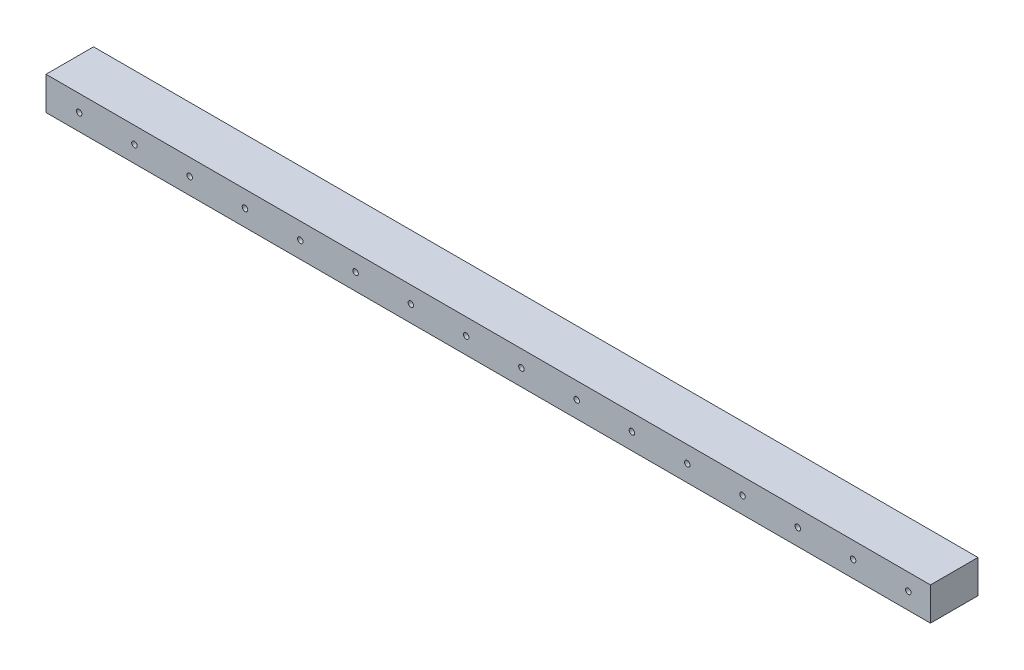
ISO-10303-21;
HEADER;
FILE_DESCRIPTION(('STEP AP214'),'2;1');
FILE_NAME('part.step','',(''),(''),'','','');
FILE_SCHEMA(('AUTOMOTIVE_DESIGN { 1 0 10303 214 1 1 1 1 }'));
ENDSEC;
DATA;
#1=APPLICATION_CONTEXT('core data for automotive mechanical design processes');
#2=APPLICATION_PROTOCOL_DEFINITION('international standard','automotive_design',2000,#1);
#3=PRODUCT_CONTEXT('',#1,'mechanical');
#4=PRODUCT('Part','Part','',(#3));
#5=PRODUCT_RELATED_PRODUCT_CATEGORY('part','',(#4));
#6=PRODUCT_DEFINITION_FORMATION('','',#4);
#7=PRODUCT_DEFINITION_CONTEXT('part definition',#1,'design');
#8=PRODUCT_DEFINITION('design','',#6,#7);
#9=PRODUCT_DEFINITION_SHAPE('','',#8);
#10=(LENGTH_UNIT() NAMED_UNIT(*) SI_UNIT(.MILLI.,.METRE.));
#11=(NAMED_UNIT(*) PLANE_ANGLE_UNIT() SI_UNIT($,.RADIAN.));
#12=(NAMED_UNIT(*) SI_UNIT($,.STERADIAN.) SOLID_ANGLE_UNIT());
#13=UNCERTAINTY_MEASURE_WITH_UNIT(LENGTH_MEASURE(1.E-05),#10,'distance_accuracy_value','');
#14=(GEOMETRIC_REPRESENTATION_CONTEXT(3) GLOBAL_UNCERTAINTY_ASSIGNED_CONTEXT((#13)) GLOBAL_UNIT_ASSIGNED_CONTEXT((#10,
#11,#12)) REPRESENTATION_CONTEXT('',''));
#15=CARTESIAN_POINT('',(0.,0.,0.));
#16=DIRECTION('',(0.,0.,1.));
#17=DIRECTION('',(1.,0.,0.));
#18=AXIS2_PLACEMENT_3D('',#15,#16,#17);
#19=CARTESIAN_POINT('',(-200.,-7.5,0.));
#20=DIRECTION('',(-1.,0.,0.));
#21=DIRECTION('',(0.,0.,1.));
#22=AXIS2_PLACEMENT_3D('',#19,#20,#21);
#23=PLANE('',#22);
#24=DIRECTION('',(0.,0.,1.));
#25=VECTOR('',#24,1.);
#26=CARTESIAN_POINT('',(-200.,7.5,0.));
#27=LINE('',#26,#25);
#28=CARTESIAN_POINT('',(-200.,7.5,0.));
#29=VERTEX_POINT('',#28);
#30=CARTESIAN_POINT('',(-200.,7.5,21.5));
#31=VERTEX_POINT('',#30);
#32=EDGE_CURVE('E244',#29,#31,#27,.T.);
#33=ORIENTED_EDGE('',*,*,#32,.F.);
#34=DIRECTION('',(0.,1.,0.));
#35=VECTOR('',#34,1.);
#36=CARTESIAN_POINT('',(-200.,-7.5,0.));
#37=LINE('',#36,#35);
#38=CARTESIAN_POINT('',(-200.,-7.5,0.));
#39=VERTEX_POINT('',#38);
#40=EDGE_CURVE('E11',#39,#29,#37,.T.);
#41=ORIENTED_EDGE('',*,*,#40,.F.);
#42=DIRECTION('',(0.,0.,1.));
#43=VECTOR('',#42,1.);
#44=CARTESIAN_POINT('',(-200.,-7.5,0.));
#45=LINE('',#44,#43);
#46=CARTESIAN_POINT('',(-200.,-7.5,21.5));
#47=VERTEX_POINT('',#46);
#48=EDGE_CURVE('E245',#39,#47,#45,.T.);
#49=ORIENTED_EDGE('',*,*,#48,.T.);
#50=DIRECTION('',(0.,1.,0.));
#51=VECTOR('',#50,1.);
#52=CARTESIAN_POINT('',(-200.,-7.5,21.5));
#53=LINE('',#52,#51);
#54=EDGE_CURVE('E48',#47,#31,#53,.T.);
#55=ORIENTED_EDGE('',*,*,#54,.T.);
#56=EDGE_LOOP('',(#33,#41,#49,#55));
#57=FACE_BOUND('',#56,.T.);
#58=ADVANCED_FACE('F45',(#57),#23,.T.);
#59=CARTESIAN_POINT('',(200.,-7.5,0.));
#60=DIRECTION('',(0.,0.,-1.));
#61=DIRECTION('',(-1.,0.,0.));
#62=AXIS2_PLACEMENT_3D('',#59,#60,#61);
#63=PLANE('',#62);
#64=DIRECTION('',(-1.,0.,0.));
#65=VECTOR('',#64,1.);
#66=CARTESIAN_POINT('',(200.,7.5,0.));
#67=LINE('',#66,#65);
#68=CARTESIAN_POINT('',(200.,7.5,0.));
#69=VERTEX_POINT('',#68);
#70=EDGE_CURVE('E248',#69,#29,#67,.T.);
#71=ORIENTED_EDGE('',*,*,#70,.F.);
#72=DIRECTION('',(0.,1.,0.));
#73=VECTOR('',#72,1.);
#74=CARTESIAN_POINT('',(200.,-7.5,0.));
#75=LINE('',#74,#73);
#76=CARTESIAN_POINT('',(200.,-7.5,0.));
#77=VERTEX_POINT('',#76);
#78=EDGE_CURVE('E54',#77,#69,#75,.T.);
#79=ORIENTED_EDGE('',*,*,#78,.F.);
#80=DIRECTION('',(-1.,0.,0.));
#81=VECTOR('',#80,1.);
#82=CARTESIAN_POINT('',(200.,-7.5,0.));
#83=LINE('',#82,#81);
#84=EDGE_CURVE('E252',#77,#39,#83,.T.);
#85=ORIENTED_EDGE('',*,*,#84,.T.);
#86=ORIENTED_EDGE('',*,*,#40,.T.);
#87=EDGE_LOOP('',(#71,#79,#85,#86));
#88=FACE_BOUND('',#87,.T.);
#89=ADVANCED_FACE('F267',(#88),#63,.T.);
#90=CARTESIAN_POINT('',(200.,-7.5,21.5));
#91=DIRECTION('',(1.,0.,0.));
#92=DIRECTION('',(0.,0.,-1.));
#93=AXIS2_PLACEMENT_3D('',#90,#91,#92);
#94=PLANE('',#93);
#95=DIRECTION('',(0.,0.,-1.));
#96=VECTOR('',#95,1.);
#97=CARTESIAN_POINT('',(200.,7.5,21.5));
#98=LINE('',#97,#96);
#99=CARTESIAN_POINT('',(200.,7.5,21.5));
#100=VERTEX_POINT('',#99);
#101=EDGE_CURVE('E259',#100,#69,#98,.T.);
#102=ORIENTED_EDGE('',*,*,#101,.F.);
#103=DIRECTION('',(0.,1.,0.));
#104=VECTOR('',#103,1.);
#105=CARTESIAN_POINT('',(200.,-7.5,21.5));
#106=LINE('',#105,#104);
#107=CARTESIAN_POINT('',(200.,-7.5,21.5));
#108=VERTEX_POINT('',#107);
#109=EDGE_CURVE('E263',#108,#100,#106,.T.);
#110=ORIENTED_EDGE('',*,*,#109,.F.);
#111=DIRECTION('',(0.,0.,-1.));
#112=VECTOR('',#111,1.);
#113=CARTESIAN_POINT('',(200.,-7.5,21.5));
#114=LINE('',#113,#112);
#115=EDGE_CURVE('E250',#108,#77,#114,.T.);
#116=ORIENTED_EDGE('',*,*,#115,.T.);
#117=ORIENTED_EDGE('',*,*,#78,.T.);
#118=EDGE_LOOP('',(#102,#110,#116,#117));
#119=FACE_BOUND('',#118,.T.);
#120=ADVANCED_FACE('F270',(#119),#94,.T.);
#121=CARTESIAN_POINT('',(-200.,-7.5,21.5));
#122=DIRECTION('',(0.,0.,1.));
#123=DIRECTION('',(1.,0.,0.));
#124=AXIS2_PLACEMENT_3D('',#121,#122,#123);
#125=PLANE('',#124);
#126=CARTESIAN_POINT('',(-185.,0.,21.5));
#127=DIRECTION('',(0.,0.,1.));
#128=DIRECTION('',(1.,0.,0.));
#129=AXIS2_PLACEMENT_3D('',#126,#127,#128);
#130=CIRCLE('',#129,1.25);
#131=CARTESIAN_POINT('',(-183.75,0.,21.5));
#132=VERTEX_POINT('',#131);
#133=EDGE_CURVE('E150',#132,#132,#130,.T.);
#134=ORIENTED_EDGE('',*,*,#133,.F.);
#135=EDGE_LOOP('',(#134));
#136=FACE_BOUND('',#135,.T.);
#137=CARTESIAN_POINT('',(-160.,0.,21.5));
#138=DIRECTION('',(0.,0.,1.));
#139=DIRECTION('',(1.,0.,0.));
#140=AXIS2_PLACEMENT_3D('',#137,#138,#139);
#141=CIRCLE('',#140,1.25);
#142=CARTESIAN_POINT('',(-158.75,0.,21.5));
#143=VERTEX_POINT('',#142);
#144=EDGE_CURVE('E149',#143,#143,#141,.T.);
#145=ORIENTED_EDGE('',*,*,#144,.F.);
#146=EDGE_LOOP('',(#145));
#147=FACE_BOUND('',#146,.T.);
#148=CARTESIAN_POINT('',(-135.,0.,21.5));
#149=DIRECTION('',(0.,0.,1.));
#150=DIRECTION('',(1.,0.,0.));
#151=AXIS2_PLACEMENT_3D('',#148,#149,#150);
#152=CIRCLE('',#151,1.25);
#153=CARTESIAN_POINT('',(-133.75,0.,21.5));
#154=VERTEX_POINT('',#153);
#155=EDGE_CURVE('E160',#154,#154,#152,.T.);
#156=ORIENTED_EDGE('',*,*,#155,.F.);
#157=EDGE_LOOP('',(#156));
#158=FACE_BOUND('',#157,.T.);
#159=CARTESIAN_POINT('',(-110.,0.,21.5));
#160=DIRECTION('',(0.,0.,1.));
#161=DIRECTION('',(1.,0.,0.));
#162=AXIS2_PLACEMENT_3D('',#159,#160,#161);
#163=CIRCLE('',#162,1.24999999999999);
#164=CARTESIAN_POINT('',(-108.75,0.,21.5));
#165=VERTEX_POINT('',#164);
#166=EDGE_CURVE('E166',#165,#165,#163,.T.);
#167=ORIENTED_EDGE('',*,*,#166,.F.);
#168=EDGE_LOOP('',(#167));
#169=FACE_BOUND('',#168,.T.);
#170=CARTESIAN_POINT('',(-85.,0.,21.5));
#171=DIRECTION('',(0.,0.,1.));
#172=DIRECTION('',(1.,0.,0.));
#173=AXIS2_PLACEMENT_3D('',#170,#171,#172);
#174=CIRCLE('',#173,1.24999999999999);
#175=CARTESIAN_POINT('',(-83.75,0.,21.5));
#176=VERTEX_POINT('',#175);
#177=EDGE_CURVE('E172',#176,#176,#174,.T.);
#178=ORIENTED_EDGE('',*,*,#177,.F.);
#179=EDGE_LOOP('',(#178));
#180=FACE_BOUND('',#179,.T.);
#181=CARTESIAN_POINT('',(-60.,0.,21.5));
#182=DIRECTION('',(0.,0.,1.));
#183=DIRECTION('',(1.,0.,0.));
#184=AXIS2_PLACEMENT_3D('',#181,#182,#183);
#185=CIRCLE('',#184,1.24999999999999);
#186=CARTESIAN_POINT('',(-58.75,0.,21.5));
#187=VERTEX_POINT('',#186);
#188=EDGE_CURVE('E178',#187,#187,#185,.T.);
#189=ORIENTED_EDGE('',*,*,#188,.F.);
#190=EDGE_LOOP('',(#189));
#191=FACE_BOUND('',#190,.T.);
#192=CARTESIAN_POINT('',(-35.,0.,21.5));
#193=DIRECTION('',(0.,0.,1.));
#194=DIRECTION('',(1.,0.,0.));
#195=AXIS2_PLACEMENT_3D('',#192,#193,#194);
#196=CIRCLE('',#195,1.24999999999999);
#197=CARTESIAN_POINT('',(-33.75,0.,21.5));
#198=VERTEX_POINT('',#197);
#199=EDGE_CURVE('E184',#198,#198,#196,.T.);
#200=ORIENTED_EDGE('',*,*,#199,.F.);
#201=EDGE_LOOP('',(#200));
#202=FACE_BOUND('',#201,.T.);
#203=CARTESIAN_POINT('',(-10.,0.,21.5));
#204=DIRECTION('',(0.,0.,1.));
#205=DIRECTION('',(1.,0.,0.));
#206=AXIS2_PLACEMENT_3D('',#203,#204,#205);
#207=CIRCLE('',#206,1.24999999999999);
#208=CARTESIAN_POINT('',(-8.75000000000005,0.,21.5));
#209=VERTEX_POINT('',#208);
#210=EDGE_CURVE('E190',#209,#209,#207,.T.);
#211=ORIENTED_EDGE('',*,*,#210,.F.);
#212=EDGE_LOOP('',(#211));
#213=FACE_BOUND('',#212,.T.);
#214=CARTESIAN_POINT('',(15.,0.,21.5));
#215=DIRECTION('',(0.,0.,1.));
#216=DIRECTION('',(1.,0.,0.));
#217=AXIS2_PLACEMENT_3D('',#214,#215,#216);
#218=CIRCLE('',#217,1.24999999999999);
#219=CARTESIAN_POINT('',(16.25,0.,21.5));
#220=VERTEX_POINT('',#219);
#221=EDGE_CURVE('E196',#220,#220,#218,.T.);
#222=ORIENTED_EDGE('',*,*,#221,.F.);
#223=EDGE_LOOP('',(#222));
#224=FACE_BOUND('',#223,.T.);
#225=CARTESIAN_POINT('',(40.,0.,21.5));
#226=DIRECTION('',(0.,0.,1.));
#227=DIRECTION('',(1.,0.,0.));
#228=AXIS2_PLACEMENT_3D('',#225,#226,#227);
#229=CIRCLE('',#228,1.24999999999999);
#230=CARTESIAN_POINT('',(41.2499999999999,0.,21.5));
#231=VERTEX_POINT('',#230);
#232=EDGE_CURVE('E202',#231,#231,#229,.T.);
#233=ORIENTED_EDGE('',*,*,#232,.F.);
#234=EDGE_LOOP('',(#233));
#235=FACE_BOUND('',#234,.T.);
#236=CARTESIAN_POINT('',(65.,0.,21.5));
#237=DIRECTION('',(0.,0.,1.));
#238=DIRECTION('',(1.,0.,0.));
#239=AXIS2_PLACEMENT_3D('',#236,#237,#238);
#240=CIRCLE('',#239,1.24999999999999);
#241=CARTESIAN_POINT('',(66.25,0.,21.5));
#242=VERTEX_POINT('',#241);
#243=EDGE_CURVE('E208',#242,#242,#240,.T.);
#244=ORIENTED_EDGE('',*,*,#243,.F.);
#245=EDGE_LOOP('',(#244));
#246=FACE_BOUND('',#245,.T.);
#247=CARTESIAN_POINT('',(90.,0.,21.5));
#248=DIRECTION('',(0.,0.,1.));
#249=DIRECTION('',(1.,0.,0.));
#250=AXIS2_PLACEMENT_3D('',#247,#248,#249);
#251=CIRCLE('',#250,1.24999999999999);
#252=CARTESIAN_POINT('',(91.25,0.,21.5));
#253=VERTEX_POINT('',#252);
#254=EDGE_CURVE('E214',#253,#253,#251,.T.);
#255=ORIENTED_EDGE('',*,*,#254,.F.);
#256=EDGE_LOOP('',(#255));
#257=FACE_BOUND('',#256,.T.);
#258=CARTESIAN_POINT('',(115.,0.,21.5));
#259=DIRECTION('',(0.,0.,1.));
#260=DIRECTION('',(1.,0.,0.));
#261=AXIS2_PLACEMENT_3D('',#258,#259,#260);
#262=CIRCLE('',#261,1.24999999999999);
#263=CARTESIAN_POINT('',(116.25,0.,21.5));
#264=VERTEX_POINT('',#263);
#265=EDGE_CURVE('E220',#264,#264,#262,.T.);
#266=ORIENTED_EDGE('',*,*,#265,.F.);
#267=EDGE_LOOP('',(#266));
#268=FACE_BOUND('',#267,.T.);
#269=CARTESIAN_POINT('',(140.,0.,21.5));
#270=DIRECTION('',(0.,0.,1.));
#271=DIRECTION('',(1.,0.,0.));
#272=AXIS2_PLACEMENT_3D('',#269,#270,#271);
#273=CIRCLE('',#272,1.25);
#274=CARTESIAN_POINT('',(141.25,0.,21.5));
#275=VERTEX_POINT('',#274);
#276=EDGE_CURVE('E226',#275,#275,#273,.T.);
#277=ORIENTED_EDGE('',*,*,#276,.F.);
#278=EDGE_LOOP('',(#277));
#279=FACE_BOUND('',#278,.T.);
#280=CARTESIAN_POINT('',(190.,0.,21.5));
#281=DIRECTION('',(0.,0.,1.));
#282=DIRECTION('',(1.,0.,0.));
#283=AXIS2_PLACEMENT_3D('',#280,#281,#282);
#284=CIRCLE('',#283,1.25);
#285=CARTESIAN_POINT('',(191.25,0.,21.5));
#286=VERTEX_POINT('',#285);
#287=EDGE_CURVE('E232',#286,#286,#284,.T.);
#288=ORIENTED_EDGE('',*,*,#287,.F.);
#289=EDGE_LOOP('',(#288));
#290=FACE_BOUND('',#289,.T.);
#291=CARTESIAN_POINT('',(165.,0.,21.5));
#292=DIRECTION('',(0.,0.,1.));
#293=DIRECTION('',(1.,0.,0.));
#294=AXIS2_PLACEMENT_3D('',#291,#292,#293);
#295=CIRCLE('',#294,1.25);
#296=CARTESIAN_POINT('',(166.25,0.,21.5));
#297=VERTEX_POINT('',#296);
#298=EDGE_CURVE('E238',#297,#297,#295,.T.);
#299=ORIENTED_EDGE('',*,*,#298,.F.);
#300=EDGE_LOOP('',(#299));
#301=FACE_BOUND('',#300,.T.);
#302=DIRECTION('',(1.,0.,0.));
#303=VECTOR('',#302,1.);
#304=CARTESIAN_POINT('',(-200.,7.5,21.5));
#305=LINE('',#304,#303);
#306=EDGE_CURVE('E256',#31,#100,#305,.T.);
#307=ORIENTED_EDGE('',*,*,#306,.F.);
#308=ORIENTED_EDGE('',*,*,#54,.F.);
#309=DIRECTION('',(1.,0.,0.));
#310=VECTOR('',#309,1.);
#311=CARTESIAN_POINT('',(-200.,-7.5,21.5));
#312=LINE('',#311,#310);
#313=EDGE_CURVE('E247',#47,#108,#312,.T.);
#314=ORIENTED_EDGE('',*,*,#313,.T.);
#315=ORIENTED_EDGE('',*,*,#109,.T.);
#316=EDGE_LOOP('',(#307,#308,#314,#315));
#317=FACE_BOUND('',#316,.T.);
#318=ADVANCED_FACE('F264',(#136,#147,#158,#169,#180,#191,#202,#213,#224,#235,#246,#257,#268,
#279,#290,#301,#317),#125,.T.);
#319=CARTESIAN_POINT('',(0.,-7.5,0.));
#320=DIRECTION('',(0.,1.,0.));
#321=DIRECTION('',(0.,0.,1.));
#322=AXIS2_PLACEMENT_3D('',#319,#320,#321);
#323=PLANE('',#322);
#324=ORIENTED_EDGE('',*,*,#48,.F.);
#325=ORIENTED_EDGE('',*,*,#84,.F.);
#326=ORIENTED_EDGE('',*,*,#115,.F.);
#327=ORIENTED_EDGE('',*,*,#313,.F.);
#328=EDGE_LOOP('',(#324,#325,#326,#327));
#329=FACE_BOUND('',#328,.T.);
#330=ADVANCED_FACE('F272',(#329),#323,.F.);
#331=CARTESIAN_POINT('',(0.,7.5,0.));
#332=DIRECTION('',(0.,1.,0.));
#333=DIRECTION('',(0.,0.,1.));
#334=AXIS2_PLACEMENT_3D('',#331,#332,#333);
#335=PLANE('',#334);
#336=ORIENTED_EDGE('',*,*,#32,.T.);
#337=ORIENTED_EDGE('',*,*,#306,.T.);
#338=ORIENTED_EDGE('',*,*,#101,.T.);
#339=ORIENTED_EDGE('',*,*,#70,.T.);
#340=EDGE_LOOP('',(#336,#337,#338,#339));
#341=FACE_BOUND('',#340,.T.);
#342=ADVANCED_FACE('F266',(#341),#335,.T.);
#343=CARTESIAN_POINT('',(165.,0.,13.));
#344=DIRECTION('',(0.,0.,1.));
#345=DIRECTION('',(1.,0.,0.));
#346=AXIS2_PLACEMENT_3D('',#343,#344,#345);
#347=CONICAL_SURFACE('',#346,1.25,1.02974425839942);
#348=CARTESIAN_POINT('',(165.,0.,12.2489242257439));
#349=VERTEX_POINT('',#348);
#350=VERTEX_LOOP('',#349);
#351=FACE_BOUND('',#350,.T.);
#352=CARTESIAN_POINT('',(165.,0.,13.));
#353=DIRECTION('',(0.,0.,1.));
#354=DIRECTION('',(1.,0.,0.));
#355=AXIS2_PLACEMENT_3D('',#352,#353,#354);
#356=CIRCLE('',#355,1.25);
#357=CARTESIAN_POINT('',(166.25,0.,13.));
#358=VERTEX_POINT('',#357);
#359=EDGE_CURVE('E241',#358,#358,#356,.T.);
#360=ORIENTED_EDGE('',*,*,#359,.T.);
#361=EDGE_LOOP('',(#360));
#362=FACE_BOUND('',#361,.T.);
#363=ADVANCED_FACE('F280',(#351,#362),#347,.F.);
#364=CARTESIAN_POINT('',(165.,0.,21.5));
#365=DIRECTION('',(0.,0.,1.));
#366=DIRECTION('',(1.,0.,0.));
#367=AXIS2_PLACEMENT_3D('',#364,#365,#366);
#368=CYLINDRICAL_SURFACE('',#367,1.25);
#369=ORIENTED_EDGE('',*,*,#359,.F.);
#370=EDGE_LOOP('',(#369));
#371=FACE_BOUND('',#370,.T.);
#372=ORIENTED_EDGE('',*,*,#298,.T.);
#373=EDGE_LOOP('',(#372));
#374=FACE_BOUND('',#373,.T.);
#375=ADVANCED_FACE('F325',(#371,#374),#368,.F.);
#376=CARTESIAN_POINT('',(190.,0.,13.));
#377=DIRECTION('',(0.,0.,1.));
#378=DIRECTION('',(1.,0.,0.));
#379=AXIS2_PLACEMENT_3D('',#376,#377,#378);
#380=CONICAL_SURFACE('',#379,1.25,1.02974425839942);
#381=CARTESIAN_POINT('',(190.,0.,12.2489242257439));
#382=VERTEX_POINT('',#381);
#383=VERTEX_LOOP('',#382);
#384=FACE_BOUND('',#383,.T.);
#385=CARTESIAN_POINT('',(190.,0.,13.));
#386=DIRECTION('',(0.,0.,1.));
#387=DIRECTION('',(1.,0.,0.));
#388=AXIS2_PLACEMENT_3D('',#385,#386,#387);
#389=CIRCLE('',#388,1.25);
#390=CARTESIAN_POINT('',(191.25,0.,13.));
#391=VERTEX_POINT('',#390);
#392=EDGE_CURVE('E235',#391,#391,#389,.T.);
#393=ORIENTED_EDGE('',*,*,#392,.T.);
#394=EDGE_LOOP('',(#393));
#395=FACE_BOUND('',#394,.T.);
#396=ADVANCED_FACE('F334',(#384,#395),#380,.F.);
#397=CARTESIAN_POINT('',(190.,0.,21.5));
#398=DIRECTION('',(0.,0.,1.));
#399=DIRECTION('',(1.,0.,0.));
#400=AXIS2_PLACEMENT_3D('',#397,#398,#399);
#401=CYLINDRICAL_SURFACE('',#400,1.25);
#402=ORIENTED_EDGE('',*,*,#392,.F.);
#403=EDGE_LOOP('',(#402));
#404=FACE_BOUND('',#403,.T.);
#405=ORIENTED_EDGE('',*,*,#287,.T.);
#406=EDGE_LOOP('',(#405));
#407=FACE_BOUND('',#406,.T.);
#408=ADVANCED_FACE('F344',(#404,#407),#401,.F.);
#409=CARTESIAN_POINT('',(140.,0.,13.));
#410=DIRECTION('',(0.,0.,1.));
#411=DIRECTION('',(1.,0.,0.));
#412=AXIS2_PLACEMENT_3D('',#409,#410,#411);
#413=CONICAL_SURFACE('',#412,1.25,1.02974425839942);
#414=CARTESIAN_POINT('',(140.,0.,12.2489242257439));
#415=VERTEX_POINT('',#414);
#416=VERTEX_LOOP('',#415);
#417=FACE_BOUND('',#416,.T.);
#418=CARTESIAN_POINT('',(140.,0.,13.));
#419=DIRECTION('',(0.,0.,1.));
#420=DIRECTION('',(1.,0.,0.));
#421=AXIS2_PLACEMENT_3D('',#418,#419,#420);
#422=CIRCLE('',#421,1.25);
#423=CARTESIAN_POINT('',(141.25,0.,13.));
#424=VERTEX_POINT('',#423);
#425=EDGE_CURVE('E229',#424,#424,#422,.T.);
#426=ORIENTED_EDGE('',*,*,#425,.T.);
#427=EDGE_LOOP('',(#426));
#428=FACE_BOUND('',#427,.T.);
#429=ADVANCED_FACE('F354',(#417,#428),#413,.F.);
#430=CARTESIAN_POINT('',(140.,0.,21.5));
#431=DIRECTION('',(0.,0.,1.));
#432=DIRECTION('',(1.,0.,0.));
#433=AXIS2_PLACEMENT_3D('',#430,#431,#432);
#434=CYLINDRICAL_SURFACE('',#433,1.25);
#435=ORIENTED_EDGE('',*,*,#425,.F.);
#436=EDGE_LOOP('',(#435));
#437=FACE_BOUND('',#436,.T.);
#438=ORIENTED_EDGE('',*,*,#276,.T.);
#439=EDGE_LOOP('',(#438));
#440=FACE_BOUND('',#439,.T.);
#441=ADVANCED_FACE('F364',(#437,#440),#434,.F.);
#442=CARTESIAN_POINT('',(115.,0.,13.));
#443=DIRECTION('',(0.,0.,1.));
#444=DIRECTION('',(1.,0.,0.));
#445=AXIS2_PLACEMENT_3D('',#442,#443,#444);
#446=CONICAL_SURFACE('',#445,1.24999999999999,1.02974425839941);
#447=CARTESIAN_POINT('',(115.,0.,12.2489242257439));
#448=VERTEX_POINT('',#447);
#449=VERTEX_LOOP('',#448);
#450=FACE_BOUND('',#449,.T.);
#451=CARTESIAN_POINT('',(115.,0.,13.));
#452=DIRECTION('',(0.,0.,1.));
#453=DIRECTION('',(1.,0.,0.));
#454=AXIS2_PLACEMENT_3D('',#451,#452,#453);
#455=CIRCLE('',#454,1.24999999999999);
#456=CARTESIAN_POINT('',(116.25,0.,13.));
#457=VERTEX_POINT('',#456);
#458=EDGE_CURVE('E223',#457,#457,#455,.T.);
#459=ORIENTED_EDGE('',*,*,#458,.T.);
#460=EDGE_LOOP('',(#459));
#461=FACE_BOUND('',#460,.T.);
#462=ADVANCED_FACE('F374',(#450,#461),#446,.F.);
#463=CARTESIAN_POINT('',(115.,0.,21.5));
#464=DIRECTION('',(0.,0.,1.));
#465=DIRECTION('',(1.,0.,0.));
#466=AXIS2_PLACEMENT_3D('',#463,#464,#465);
#467=CYLINDRICAL_SURFACE('',#466,1.24999999999999);
#468=ORIENTED_EDGE('',*,*,#458,.F.);
#469=EDGE_LOOP('',(#468));
#470=FACE_BOUND('',#469,.T.);
#471=ORIENTED_EDGE('',*,*,#265,.T.);
#472=EDGE_LOOP('',(#471));
#473=FACE_BOUND('',#472,.T.);
#474=ADVANCED_FACE('F384',(#470,#473),#467,.F.);
#475=CARTESIAN_POINT('',(90.,0.,13.));
#476=DIRECTION('',(0.,0.,1.));
#477=DIRECTION('',(1.,0.,0.));
#478=AXIS2_PLACEMENT_3D('',#475,#476,#477);
#479=CONICAL_SURFACE('',#478,1.24999999999999,1.02974425839941);
#480=CARTESIAN_POINT('',(90.,0.,12.2489242257439));
#481=VERTEX_POINT('',#480);
#482=VERTEX_LOOP('',#481);
#483=FACE_BOUND('',#482,.T.);
#484=CARTESIAN_POINT('',(90.,0.,13.));
#485=DIRECTION('',(0.,0.,1.));
#486=DIRECTION('',(1.,0.,0.));
#487=AXIS2_PLACEMENT_3D('',#484,#485,#486);
#488=CIRCLE('',#487,1.24999999999999);
#489=CARTESIAN_POINT('',(91.25,0.,13.));
#490=VERTEX_POINT('',#489);
#491=EDGE_CURVE('E217',#490,#490,#488,.T.);
#492=ORIENTED_EDGE('',*,*,#491,.T.);
#493=EDGE_LOOP('',(#492));
#494=FACE_BOUND('',#493,.T.);
#495=ADVANCED_FACE('F394',(#483,#494),#479,.F.);
#496=CARTESIAN_POINT('',(90.,0.,21.5));
#497=DIRECTION('',(0.,0.,1.));
#498=DIRECTION('',(1.,0.,0.));
#499=AXIS2_PLACEMENT_3D('',#496,#497,#498);
#500=CYLINDRICAL_SURFACE('',#499,1.24999999999999);
#501=ORIENTED_EDGE('',*,*,#491,.F.);
#502=EDGE_LOOP('',(#501));
#503=FACE_BOUND('',#502,.T.);
#504=ORIENTED_EDGE('',*,*,#254,.T.);
#505=EDGE_LOOP('',(#504));
#506=FACE_BOUND('',#505,.T.);
#507=ADVANCED_FACE('F404',(#503,#506),#500,.F.);
#508=CARTESIAN_POINT('',(65.,0.,13.));
#509=DIRECTION('',(0.,0.,1.));
#510=DIRECTION('',(1.,0.,0.));
#511=AXIS2_PLACEMENT_3D('',#508,#509,#510);
#512=CONICAL_SURFACE('',#511,1.24999999999999,1.02974425839941);
#513=CARTESIAN_POINT('',(65.,0.,12.2489242257439));
#514=VERTEX_POINT('',#513);
#515=VERTEX_LOOP('',#514);
#516=FACE_BOUND('',#515,.T.);
#517=CARTESIAN_POINT('',(65.,0.,13.));
#518=DIRECTION('',(0.,0.,1.));
#519=DIRECTION('',(1.,0.,0.));
#520=AXIS2_PLACEMENT_3D('',#517,#518,#519);
#521=CIRCLE('',#520,1.24999999999999);
#522=CARTESIAN_POINT('',(66.25,0.,13.));
#523=VERTEX_POINT('',#522);
#524=EDGE_CURVE('E211',#523,#523,#521,.T.);
#525=ORIENTED_EDGE('',*,*,#524,.T.);
#526=EDGE_LOOP('',(#525));
#527=FACE_BOUND('',#526,.T.);
#528=ADVANCED_FACE('F414',(#516,#527),#512,.F.);
#529=CARTESIAN_POINT('',(65.,0.,21.5));
#530=DIRECTION('',(0.,0.,1.));
#531=DIRECTION('',(1.,0.,0.));
#532=AXIS2_PLACEMENT_3D('',#529,#530,#531);
#533=CYLINDRICAL_SURFACE('',#532,1.24999999999999);
#534=ORIENTED_EDGE('',*,*,#524,.F.);
#535=EDGE_LOOP('',(#534));
#536=FACE_BOUND('',#535,.T.);
#537=ORIENTED_EDGE('',*,*,#243,.T.);
#538=EDGE_LOOP('',(#537));
#539=FACE_BOUND('',#538,.T.);
#540=ADVANCED_FACE('F424',(#536,#539),#533,.F.);
#541=CARTESIAN_POINT('',(40.,0.,13.));
#542=DIRECTION('',(0.,0.,1.));
#543=DIRECTION('',(1.,0.,0.));
#544=AXIS2_PLACEMENT_3D('',#541,#542,#543);
#545=CONICAL_SURFACE('',#544,1.24999999999999,1.02974425839941);
#546=CARTESIAN_POINT('',(40.,0.,12.2489242257439));
#547=VERTEX_POINT('',#546);
#548=VERTEX_LOOP('',#547);
#549=FACE_BOUND('',#548,.T.);
#550=CARTESIAN_POINT('',(40.,0.,13.));
#551=DIRECTION('',(0.,0.,1.));
#552=DIRECTION('',(1.,0.,0.));
#553=AXIS2_PLACEMENT_3D('',#550,#551,#552);
#554=CIRCLE('',#553,1.24999999999999);
#555=CARTESIAN_POINT('',(41.2499999999999,0.,13.));
#556=VERTEX_POINT('',#555);
#557=EDGE_CURVE('E205',#556,#556,#554,.T.);
#558=ORIENTED_EDGE('',*,*,#557,.T.);
#559=EDGE_LOOP('',(#558));
#560=FACE_BOUND('',#559,.T.);
#561=ADVANCED_FACE('F434',(#549,#560),#545,.F.);
#562=CARTESIAN_POINT('',(40.,0.,21.5));
#563=DIRECTION('',(0.,0.,1.));
#564=DIRECTION('',(1.,0.,0.));
#565=AXIS2_PLACEMENT_3D('',#562,#563,#564);
#566=CYLINDRICAL_SURFACE('',#565,1.24999999999999);
#567=ORIENTED_EDGE('',*,*,#557,.F.);
#568=EDGE_LOOP('',(#567));
#569=FACE_BOUND('',#568,.T.);
#570=ORIENTED_EDGE('',*,*,#232,.T.);
#571=EDGE_LOOP('',(#570));
#572=FACE_BOUND('',#571,.T.);
#573=ADVANCED_FACE('F444',(#569,#572),#566,.F.);
#574=CARTESIAN_POINT('',(15.,0.,13.));
#575=DIRECTION('',(0.,0.,1.));
#576=DIRECTION('',(1.,0.,0.));
#577=AXIS2_PLACEMENT_3D('',#574,#575,#576);
#578=CONICAL_SURFACE('',#577,1.24999999999999,1.02974425839941);
#579=CARTESIAN_POINT('',(15.,0.,12.2489242257439));
#580=VERTEX_POINT('',#579);
#581=VERTEX_LOOP('',#580);
#582=FACE_BOUND('',#581,.T.);
#583=CARTESIAN_POINT('',(15.,0.,13.));
#584=DIRECTION('',(0.,0.,1.));
#585=DIRECTION('',(1.,0.,0.));
#586=AXIS2_PLACEMENT_3D('',#583,#584,#585);
#587=CIRCLE('',#586,1.24999999999999);
#588=CARTESIAN_POINT('',(16.2499999999999,0.,13.));
#589=VERTEX_POINT('',#588);
#590=EDGE_CURVE('E199',#589,#589,#587,.T.);
#591=ORIENTED_EDGE('',*,*,#590,.T.);
#592=EDGE_LOOP('',(#591));
#593=FACE_BOUND('',#592,.T.);
#594=ADVANCED_FACE('F454',(#582,#593),#578,.F.);
#595=CARTESIAN_POINT('',(15.,0.,21.5));
#596=DIRECTION('',(0.,0.,1.));
#597=DIRECTION('',(1.,0.,0.));
#598=AXIS2_PLACEMENT_3D('',#595,#596,#597);
#599=CYLINDRICAL_SURFACE('',#598,1.24999999999999);
#600=ORIENTED_EDGE('',*,*,#590,.F.);
#601=EDGE_LOOP('',(#600));
#602=FACE_BOUND('',#601,.T.);
#603=ORIENTED_EDGE('',*,*,#221,.T.);
#604=EDGE_LOOP('',(#603));
#605=FACE_BOUND('',#604,.T.);
#606=ADVANCED_FACE('F464',(#602,#605),#599,.F.);
#607=CARTESIAN_POINT('',(-10.,0.,13.));
#608=DIRECTION('',(0.,0.,1.));
#609=DIRECTION('',(1.,0.,0.));
#610=AXIS2_PLACEMENT_3D('',#607,#608,#609);
#611=CONICAL_SURFACE('',#610,1.24999999999999,1.02974425839941);
#612=CARTESIAN_POINT('',(-10.,0.,12.2489242257439));
#613=VERTEX_POINT('',#612);
#614=VERTEX_LOOP('',#613);
#615=FACE_BOUND('',#614,.T.);
#616=CARTESIAN_POINT('',(-10.,0.,13.));
#617=DIRECTION('',(0.,0.,1.));
#618=DIRECTION('',(1.,0.,0.));
#619=AXIS2_PLACEMENT_3D('',#616,#617,#618);
#620=CIRCLE('',#619,1.24999999999999);
#621=CARTESIAN_POINT('',(-8.75000000000005,0.,13.));
#622=VERTEX_POINT('',#621);
#623=EDGE_CURVE('E193',#622,#622,#620,.T.);
#624=ORIENTED_EDGE('',*,*,#623,.T.);
#625=EDGE_LOOP('',(#624));
#626=FACE_BOUND('',#625,.T.);
#627=ADVANCED_FACE('F474',(#615,#626),#611,.F.);
#628=CARTESIAN_POINT('',(-10.,0.,21.5));
#629=DIRECTION('',(0.,0.,1.));
#630=DIRECTION('',(1.,0.,0.));
#631=AXIS2_PLACEMENT_3D('',#628,#629,#630);
#632=CYLINDRICAL_SURFACE('',#631,1.24999999999999);
#633=ORIENTED_EDGE('',*,*,#623,.F.);
#634=EDGE_LOOP('',(#633));
#635=FACE_BOUND('',#634,.T.);
#636=ORIENTED_EDGE('',*,*,#210,.T.);
#637=EDGE_LOOP('',(#636));
#638=FACE_BOUND('',#637,.T.);
#639=ADVANCED_FACE('F484',(#635,#638),#632,.F.);
#640=CARTESIAN_POINT('',(-35.,0.,13.));
#641=DIRECTION('',(0.,0.,1.));
#642=DIRECTION('',(1.,0.,0.));
#643=AXIS2_PLACEMENT_3D('',#640,#641,#642);
#644=CONICAL_SURFACE('',#643,1.24999999999999,1.02974425839941);
#645=CARTESIAN_POINT('',(-35.,0.,12.2489242257439));
#646=VERTEX_POINT('',#645);
#647=VERTEX_LOOP('',#646);
#648=FACE_BOUND('',#647,.T.);
#649=CARTESIAN_POINT('',(-35.,0.,13.));
#650=DIRECTION('',(0.,0.,1.));
#651=DIRECTION('',(1.,0.,0.));
#652=AXIS2_PLACEMENT_3D('',#649,#650,#651);
#653=CIRCLE('',#652,1.24999999999999);
#654=CARTESIAN_POINT('',(-33.75,0.,13.));
#655=VERTEX_POINT('',#654);
#656=EDGE_CURVE('E187',#655,#655,#653,.T.);
#657=ORIENTED_EDGE('',*,*,#656,.T.);
#658=EDGE_LOOP('',(#657));
#659=FACE_BOUND('',#658,.T.);
#660=ADVANCED_FACE('F494',(#648,#659),#644,.F.);
#661=CARTESIAN_POINT('',(-35.,0.,21.5));
#662=DIRECTION('',(0.,0.,1.));
#663=DIRECTION('',(1.,0.,0.));
#664=AXIS2_PLACEMENT_3D('',#661,#662,#663);
#665=CYLINDRICAL_SURFACE('',#664,1.24999999999999);
#666=ORIENTED_EDGE('',*,*,#656,.F.);
#667=EDGE_LOOP('',(#666));
#668=FACE_BOUND('',#667,.T.);
#669=ORIENTED_EDGE('',*,*,#199,.T.);
#670=EDGE_LOOP('',(#669));
#671=FACE_BOUND('',#670,.T.);
#672=ADVANCED_FACE('F504',(#668,#671),#665,.F.);
#673=CARTESIAN_POINT('',(-60.,0.,13.));
#674=DIRECTION('',(0.,0.,1.));
#675=DIRECTION('',(1.,0.,0.));
#676=AXIS2_PLACEMENT_3D('',#673,#674,#675);
#677=CONICAL_SURFACE('',#676,1.24999999999999,1.02974425839941);
#678=CARTESIAN_POINT('',(-60.,0.,12.2489242257439));
#679=VERTEX_POINT('',#678);
#680=VERTEX_LOOP('',#679);
#681=FACE_BOUND('',#680,.T.);
#682=CARTESIAN_POINT('',(-60.,0.,13.));
#683=DIRECTION('',(0.,0.,1.));
#684=DIRECTION('',(1.,0.,0.));
#685=AXIS2_PLACEMENT_3D('',#682,#683,#684);
#686=CIRCLE('',#685,1.24999999999999);
#687=CARTESIAN_POINT('',(-58.75,0.,13.));
#688=VERTEX_POINT('',#687);
#689=EDGE_CURVE('E181',#688,#688,#686,.T.);
#690=ORIENTED_EDGE('',*,*,#689,.T.);
#691=EDGE_LOOP('',(#690));
#692=FACE_BOUND('',#691,.T.);
#693=ADVANCED_FACE('F514',(#681,#692),#677,.F.);
#694=CARTESIAN_POINT('',(-60.,0.,21.5));
#695=DIRECTION('',(0.,0.,1.));
#696=DIRECTION('',(1.,0.,0.));
#697=AXIS2_PLACEMENT_3D('',#694,#695,#696);
#698=CYLINDRICAL_SURFACE('',#697,1.24999999999999);
#699=ORIENTED_EDGE('',*,*,#689,.F.);
#700=EDGE_LOOP('',(#699));
#701=FACE_BOUND('',#700,.T.);
#702=ORIENTED_EDGE('',*,*,#188,.T.);
#703=EDGE_LOOP('',(#702));
#704=FACE_BOUND('',#703,.T.);
#705=ADVANCED_FACE('F524',(#701,#704),#698,.F.);
#706=CARTESIAN_POINT('',(-85.,0.,13.));
#707=DIRECTION('',(0.,0.,1.));
#708=DIRECTION('',(1.,0.,0.));
#709=AXIS2_PLACEMENT_3D('',#706,#707,#708);
#710=CONICAL_SURFACE('',#709,1.24999999999999,1.02974425839941);
#711=CARTESIAN_POINT('',(-85.,0.,12.2489242257439));
#712=VERTEX_POINT('',#711);
#713=VERTEX_LOOP('',#712);
#714=FACE_BOUND('',#713,.T.);
#715=CARTESIAN_POINT('',(-85.,0.,13.));
#716=DIRECTION('',(0.,0.,1.));
#717=DIRECTION('',(1.,0.,0.));
#718=AXIS2_PLACEMENT_3D('',#715,#716,#717);
#719=CIRCLE('',#718,1.24999999999999);
#720=CARTESIAN_POINT('',(-83.75,0.,13.));
#721=VERTEX_POINT('',#720);
#722=EDGE_CURVE('E175',#721,#721,#719,.T.);
#723=ORIENTED_EDGE('',*,*,#722,.T.);
#724=EDGE_LOOP('',(#723));
#725=FACE_BOUND('',#724,.T.);
#726=ADVANCED_FACE('F534',(#714,#725),#710,.F.);
#727=CARTESIAN_POINT('',(-85.,0.,21.5));
#728=DIRECTION('',(0.,0.,1.));
#729=DIRECTION('',(1.,0.,0.));
#730=AXIS2_PLACEMENT_3D('',#727,#728,#729);
#731=CYLINDRICAL_SURFACE('',#730,1.24999999999999);
#732=ORIENTED_EDGE('',*,*,#722,.F.);
#733=EDGE_LOOP('',(#732));
#734=FACE_BOUND('',#733,.T.);
#735=ORIENTED_EDGE('',*,*,#177,.T.);
#736=EDGE_LOOP('',(#735));
#737=FACE_BOUND('',#736,.T.);
#738=ADVANCED_FACE('F544',(#734,#737),#731,.F.);
#739=CARTESIAN_POINT('',(-110.,0.,13.));
#740=DIRECTION('',(0.,0.,1.));
#741=DIRECTION('',(1.,0.,0.));
#742=AXIS2_PLACEMENT_3D('',#739,#740,#741);
#743=CONICAL_SURFACE('',#742,1.24999999999999,1.02974425839941);
#744=CARTESIAN_POINT('',(-110.,0.,12.2489242257439));
#745=VERTEX_POINT('',#744);
#746=VERTEX_LOOP('',#745);
#747=FACE_BOUND('',#746,.T.);
#748=CARTESIAN_POINT('',(-110.,0.,13.));
#749=DIRECTION('',(0.,0.,1.));
#750=DIRECTION('',(1.,0.,0.));
#751=AXIS2_PLACEMENT_3D('',#748,#749,#750);
#752=CIRCLE('',#751,1.24999999999999);
#753=CARTESIAN_POINT('',(-108.75,0.,13.));
#754=VERTEX_POINT('',#753);
#755=EDGE_CURVE('E169',#754,#754,#752,.T.);
#756=ORIENTED_EDGE('',*,*,#755,.T.);
#757=EDGE_LOOP('',(#756));
#758=FACE_BOUND('',#757,.T.);
#759=ADVANCED_FACE('F554',(#747,#758),#743,.F.);
#760=CARTESIAN_POINT('',(-110.,0.,21.5));
#761=DIRECTION('',(0.,0.,1.));
#762=DIRECTION('',(1.,0.,0.));
#763=AXIS2_PLACEMENT_3D('',#760,#761,#762);
#764=CYLINDRICAL_SURFACE('',#763,1.24999999999999);
#765=ORIENTED_EDGE('',*,*,#755,.F.);
#766=EDGE_LOOP('',(#765));
#767=FACE_BOUND('',#766,.T.);
#768=ORIENTED_EDGE('',*,*,#166,.T.);
#769=EDGE_LOOP('',(#768));
#770=FACE_BOUND('',#769,.T.);
#771=ADVANCED_FACE('F564',(#767,#770),#764,.F.);
#772=CARTESIAN_POINT('',(-135.,0.,13.));
#773=DIRECTION('',(0.,0.,1.));
#774=DIRECTION('',(1.,0.,0.));
#775=AXIS2_PLACEMENT_3D('',#772,#773,#774);
#776=CONICAL_SURFACE('',#775,1.25,1.02974425839942);
#777=CARTESIAN_POINT('',(-135.,0.,12.2489242257439));
#778=VERTEX_POINT('',#777);
#779=VERTEX_LOOP('',#778);
#780=FACE_BOUND('',#779,.T.);
#781=CARTESIAN_POINT('',(-135.,0.,13.));
#782=DIRECTION('',(0.,0.,1.));
#783=DIRECTION('',(1.,0.,0.));
#784=AXIS2_PLACEMENT_3D('',#781,#782,#783);
#785=CIRCLE('',#784,1.25);
#786=CARTESIAN_POINT('',(-133.75,0.,13.));
#787=VERTEX_POINT('',#786);
#788=EDGE_CURVE('E163',#787,#787,#785,.T.);
#789=ORIENTED_EDGE('',*,*,#788,.T.);
#790=EDGE_LOOP('',(#789));
#791=FACE_BOUND('',#790,.T.);
#792=ADVANCED_FACE('F574',(#780,#791),#776,.F.);
#793=CARTESIAN_POINT('',(-135.,0.,21.5));
#794=DIRECTION('',(0.,0.,1.));
#795=DIRECTION('',(1.,0.,0.));
#796=AXIS2_PLACEMENT_3D('',#793,#794,#795);
#797=CYLINDRICAL_SURFACE('',#796,1.25);
#798=ORIENTED_EDGE('',*,*,#788,.F.);
#799=EDGE_LOOP('',(#798));
#800=FACE_BOUND('',#799,.T.);
#801=ORIENTED_EDGE('',*,*,#155,.T.);
#802=EDGE_LOOP('',(#801));
#803=FACE_BOUND('',#802,.T.);
#804=ADVANCED_FACE('F584',(#800,#803),#797,.F.);
#805=CARTESIAN_POINT('',(-160.,0.,13.));
#806=DIRECTION('',(0.,0.,1.));
#807=DIRECTION('',(1.,0.,0.));
#808=AXIS2_PLACEMENT_3D('',#805,#806,#807);
#809=CONICAL_SURFACE('',#808,1.25,1.02974425839942);
#810=CARTESIAN_POINT('',(-160.,0.,12.2489242257439));
#811=VERTEX_POINT('',#810);
#812=VERTEX_LOOP('',#811);
#813=FACE_BOUND('',#812,.T.);
#814=CARTESIAN_POINT('',(-160.,0.,13.));
#815=DIRECTION('',(0.,0.,1.));
#816=DIRECTION('',(1.,0.,0.));
#817=AXIS2_PLACEMENT_3D('',#814,#815,#816);
#818=CIRCLE('',#817,1.25);
#819=CARTESIAN_POINT('',(-158.75,0.,13.));
#820=VERTEX_POINT('',#819);
#821=EDGE_CURVE('E153',#820,#820,#818,.T.);
#822=ORIENTED_EDGE('',*,*,#821,.T.);
#823=EDGE_LOOP('',(#822));
#824=FACE_BOUND('',#823,.T.);
#825=ADVANCED_FACE('F594',(#813,#824),#809,.F.);
#826=CARTESIAN_POINT('',(-160.,0.,21.5));
#827=DIRECTION('',(0.,0.,1.));
#828=DIRECTION('',(1.,0.,0.));
#829=AXIS2_PLACEMENT_3D('',#826,#827,#828);
#830=CYLINDRICAL_SURFACE('',#829,1.25);
#831=ORIENTED_EDGE('',*,*,#821,.F.);
#832=EDGE_LOOP('',(#831));
#833=FACE_BOUND('',#832,.T.);
#834=ORIENTED_EDGE('',*,*,#144,.T.);
#835=EDGE_LOOP('',(#834));
#836=FACE_BOUND('',#835,.T.);
#837=ADVANCED_FACE('F143',(#833,#836),#830,.F.);
#838=CARTESIAN_POINT('',(-185.,0.,13.));
#839=DIRECTION('',(0.,0.,1.));
#840=DIRECTION('',(1.,0.,0.));
#841=AXIS2_PLACEMENT_3D('',#838,#839,#840);
#842=CONICAL_SURFACE('',#841,1.25,1.02974425839942);
#843=CARTESIAN_POINT('',(-185.,0.,12.2489242257439));
#844=VERTEX_POINT('',#843);
#845=VERTEX_LOOP('',#844);
#846=FACE_BOUND('',#845,.T.);
#847=CARTESIAN_POINT('',(-185.,0.,13.));
#848=DIRECTION('',(0.,0.,1.));
#849=DIRECTION('',(1.,0.,0.));
#850=AXIS2_PLACEMENT_3D('',#847,#848,#849);
#851=CIRCLE('',#850,1.25);
#852=CARTESIAN_POINT('',(-183.75,0.,13.));
#853=VERTEX_POINT('',#852);
#854=EDGE_CURVE('E147',#853,#853,#851,.T.);
#855=ORIENTED_EDGE('',*,*,#854,.T.);
#856=EDGE_LOOP('',(#855));
#857=FACE_BOUND('',#856,.T.);
#858=ADVANCED_FACE('F139',(#846,#857),#842,.F.);
#859=CARTESIAN_POINT('',(-185.,0.,21.5));
#860=DIRECTION('',(0.,0.,1.));
#861=DIRECTION('',(1.,0.,0.));
#862=AXIS2_PLACEMENT_3D('',#859,#860,#861);
#863=CYLINDRICAL_SURFACE('',#862,1.25);
#864=ORIENTED_EDGE('',*,*,#854,.F.);
#865=EDGE_LOOP('',(#864));
#866=FACE_BOUND('',#865,.T.);
#867=ORIENTED_EDGE('',*,*,#133,.T.);
#868=EDGE_LOOP('',(#867));
#869=FACE_BOUND('',#868,.T.);
#870=ADVANCED_FACE('F142',(#866,#869),#863,.F.);
#871=CLOSED_SHELL('',(#58,#89,#120,#318,#330,#342,#363,#375,#396,#408,#429,#441,#462,#474,#495,
#507,#528,#540,#561,#573,#594,#606,#627,#639,#660,#672,#693,#705,#726,#738,#759,#771,#792,#804,
#825,#837,#858,#870));
#872=MANIFOLD_SOLID_BREP('B2',#871);
#873=ADVANCED_BREP_SHAPE_REPRESENTATION('',(#18,#872),#14);
#874=SHAPE_DEFINITION_REPRESENTATION(#9,#873);
ENDSEC;
END-ISO-10303-21;
